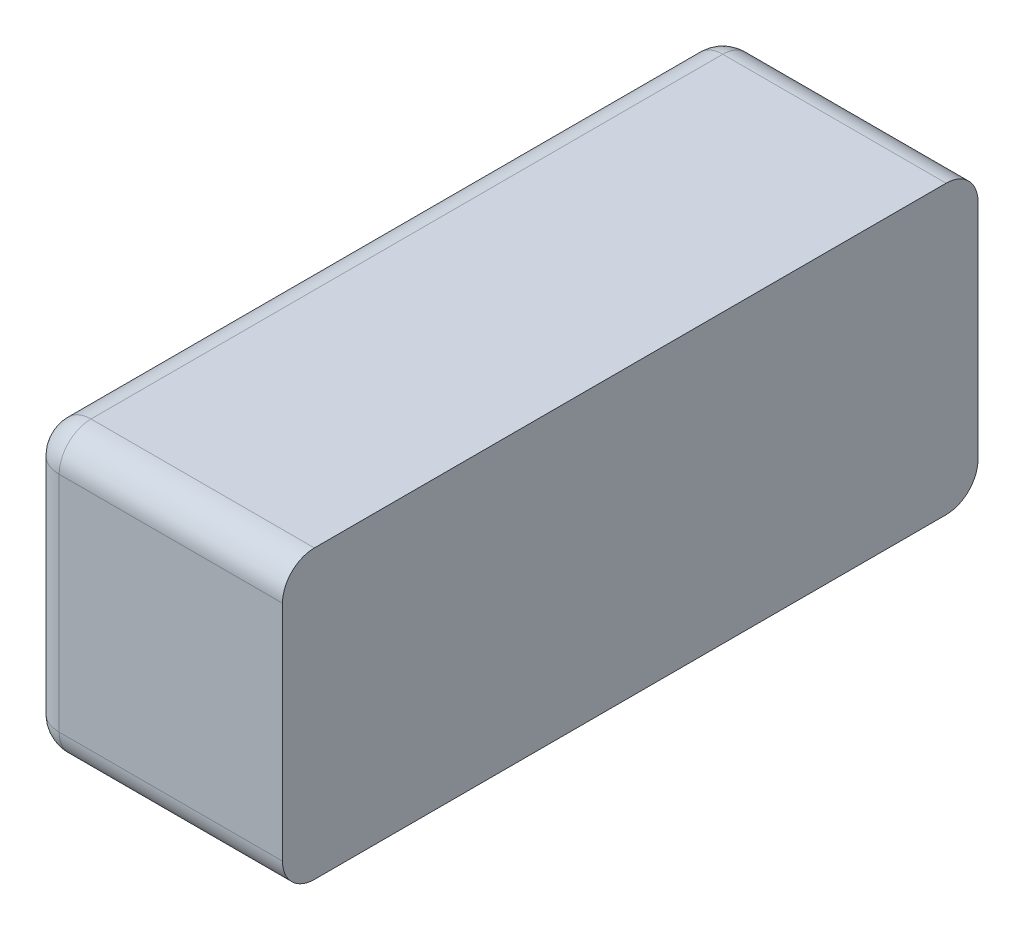
ISO-10303-21;
HEADER;
FILE_DESCRIPTION(('STEP AP214'),'2;1');
FILE_NAME('part.step','',(''),(''),'','','');
FILE_SCHEMA(('AUTOMOTIVE_DESIGN { 1 0 10303 214 1 1 1 1 }'));
ENDSEC;
DATA;
#1=APPLICATION_CONTEXT('core data for automotive mechanical design processes');
#2=APPLICATION_PROTOCOL_DEFINITION('international standard','automotive_design',2000,#1);
#3=PRODUCT_CONTEXT('',#1,'mechanical');
#4=PRODUCT('Part','Part','',(#3));
#5=PRODUCT_RELATED_PRODUCT_CATEGORY('part','',(#4));
#6=PRODUCT_DEFINITION_FORMATION('','',#4);
#7=PRODUCT_DEFINITION_CONTEXT('part definition',#1,'design');
#8=PRODUCT_DEFINITION('design','',#6,#7);
#9=PRODUCT_DEFINITION_SHAPE('','',#8);
#10=(LENGTH_UNIT() NAMED_UNIT(*) SI_UNIT(.MILLI.,.METRE.));
#11=(NAMED_UNIT(*) PLANE_ANGLE_UNIT() SI_UNIT($,.RADIAN.));
#12=(NAMED_UNIT(*) SI_UNIT($,.STERADIAN.) SOLID_ANGLE_UNIT());
#13=UNCERTAINTY_MEASURE_WITH_UNIT(LENGTH_MEASURE(1.E-05),#10,'distance_accuracy_value','');
#14=(GEOMETRIC_REPRESENTATION_CONTEXT(3) GLOBAL_UNCERTAINTY_ASSIGNED_CONTEXT((#13)) GLOBAL_UNIT_ASSIGNED_CONTEXT((#10,
#11,#12)) REPRESENTATION_CONTEXT('',''));
#15=CARTESIAN_POINT('',(0.,0.,0.));
#16=DIRECTION('',(0.,0.,1.));
#17=DIRECTION('',(1.,0.,0.));
#18=AXIS2_PLACEMENT_3D('',#15,#16,#17);
#19=CARTESIAN_POINT('',(-25.7142857142857,22.5,109.));
#20=DIRECTION('',(1.,0.,0.));
#21=DIRECTION('',(0.,0.,-1.));
#22=AXIS2_PLACEMENT_3D('',#19,#20,#21);
#23=PLANE('',#22);
#24=DIRECTION('',(0.,-1.,0.));
#25=VECTOR('',#24,1.);
#26=CARTESIAN_POINT('',(-25.7142857142857,22.5,5.));
#27=LINE('',#26,#25);
#28=CARTESIAN_POINT('',(-25.7142857142857,17.5,5.));
#29=VERTEX_POINT('',#28);
#30=CARTESIAN_POINT('',(-25.7142857142857,-17.5,5.));
#31=VERTEX_POINT('',#30);
#32=EDGE_CURVE('E221',#29,#31,#27,.T.);
#33=ORIENTED_EDGE('',*,*,#32,.T.);
#34=DIRECTION('',(0.,0.,-1.));
#35=VECTOR('',#34,1.);
#36=CARTESIAN_POINT('',(-25.7142857142857,-17.5,109.));
#37=LINE('',#36,#35);
#38=CARTESIAN_POINT('',(-25.7142857142857,-17.5,104.));
#39=VERTEX_POINT('',#38);
#40=EDGE_CURVE('E233',#31,#39,#37,.F.);
#41=ORIENTED_EDGE('',*,*,#40,.T.);
#42=DIRECTION('',(0.,-1.,0.));
#43=VECTOR('',#42,1.);
#44=CARTESIAN_POINT('',(-25.7142857142857,22.5,104.));
#45=LINE('',#44,#43);
#46=CARTESIAN_POINT('',(-25.7142857142857,17.5,104.));
#47=VERTEX_POINT('',#46);
#48=EDGE_CURVE('E229',#39,#47,#45,.F.);
#49=ORIENTED_EDGE('',*,*,#48,.T.);
#50=DIRECTION('',(0.,0.,-1.));
#51=VECTOR('',#50,1.);
#52=CARTESIAN_POINT('',(-25.7142857142857,17.5,109.));
#53=LINE('',#52,#51);
#54=EDGE_CURVE('E138',#47,#29,#53,.T.);
#55=ORIENTED_EDGE('',*,*,#54,.T.);
#56=EDGE_LOOP('',(#33,#41,#49,#55));
#57=FACE_BOUND('',#56,.T.);
#58=ADVANCED_FACE('F44',(#57),#23,.F.);
#59=CARTESIAN_POINT('',(-25.7142857142857,-22.5,109.));
#60=DIRECTION('',(0.,1.,0.));
#61=DIRECTION('',(0.,0.,1.));
#62=AXIS2_PLACEMENT_3D('',#59,#60,#61);
#63=PLANE('',#62);
#64=DIRECTION('',(0.,0.,-1.));
#65=VECTOR('',#64,1.);
#66=CARTESIAN_POINT('',(-20.7142857142857,-22.5,109.));
#67=LINE('',#66,#65);
#68=CARTESIAN_POINT('',(-20.7142857142857,-22.5,104.));
#69=VERTEX_POINT('',#68);
#70=CARTESIAN_POINT('',(-20.7142857142857,-22.5,5.));
#71=VERTEX_POINT('',#70);
#72=EDGE_CURVE('E243',#69,#71,#67,.T.);
#73=ORIENTED_EDGE('',*,*,#72,.T.);
#74=DIRECTION('',(1.,0.,0.));
#75=VECTOR('',#74,1.);
#76=CARTESIAN_POINT('',(-25.7142857142857,-22.5,5.));
#77=LINE('',#76,#75);
#78=CARTESIAN_POINT('',(14.2857142857143,-22.5,5.));
#79=VERTEX_POINT('',#78);
#80=EDGE_CURVE('E246',#71,#79,#77,.T.);
#81=ORIENTED_EDGE('',*,*,#80,.T.);
#82=DIRECTION('',(0.,0.,-1.));
#83=VECTOR('',#82,1.);
#84=CARTESIAN_POINT('',(14.2857142857143,-22.5,109.));
#85=LINE('',#84,#83);
#86=CARTESIAN_POINT('',(14.2857142857143,-22.5,104.));
#87=VERTEX_POINT('',#86);
#88=EDGE_CURVE('E212',#87,#79,#85,.T.);
#89=ORIENTED_EDGE('',*,*,#88,.F.);
#90=DIRECTION('',(1.,0.,0.));
#91=VECTOR('',#90,1.);
#92=CARTESIAN_POINT('',(-25.7142857142857,-22.5,104.));
#93=LINE('',#92,#91);
#94=EDGE_CURVE('E155',#87,#69,#93,.F.);
#95=ORIENTED_EDGE('',*,*,#94,.T.);
#96=EDGE_LOOP('',(#73,#81,#89,#95));
#97=FACE_BOUND('',#96,.T.);
#98=ADVANCED_FACE('F276',(#97),#63,.F.);
#99=CARTESIAN_POINT('',(14.2857142857143,-22.5,109.));
#100=DIRECTION('',(-1.,0.,0.));
#101=DIRECTION('',(0.,0.,1.));
#102=AXIS2_PLACEMENT_3D('',#99,#100,#101);
#103=PLANE('',#102);
#104=ORIENTED_EDGE('',*,*,#88,.T.);
#105=CARTESIAN_POINT('',(14.2857142857143,-17.5,5.));
#106=DIRECTION('',(-1.,0.,0.));
#107=DIRECTION('',(0.,0.,1.));
#108=AXIS2_PLACEMENT_3D('',#105,#106,#107);
#109=CIRCLE('',#108,5.);
#110=CARTESIAN_POINT('',(14.2857142857143,-17.5,0.));
#111=VERTEX_POINT('',#110);
#112=EDGE_CURVE('E11',#79,#111,#109,.F.);
#113=ORIENTED_EDGE('',*,*,#112,.T.);
#114=DIRECTION('',(0.,1.,0.));
#115=VECTOR('',#114,1.);
#116=CARTESIAN_POINT('',(14.2857142857143,-22.5,0.));
#117=LINE('',#116,#115);
#118=CARTESIAN_POINT('',(14.2857142857143,17.5,0.));
#119=VERTEX_POINT('',#118);
#120=EDGE_CURVE('E146',#111,#119,#117,.T.);
#121=ORIENTED_EDGE('',*,*,#120,.T.);
#122=CARTESIAN_POINT('',(14.2857142857143,17.5,5.));
#123=DIRECTION('',(-1.,0.,0.));
#124=DIRECTION('',(0.,0.,1.));
#125=AXIS2_PLACEMENT_3D('',#122,#123,#124);
#126=CIRCLE('',#125,5.);
#127=CARTESIAN_POINT('',(14.2857142857143,22.5,5.));
#128=VERTEX_POINT('',#127);
#129=EDGE_CURVE('E54',#119,#128,#126,.F.);
#130=ORIENTED_EDGE('',*,*,#129,.T.);
#131=DIRECTION('',(0.,0.,-1.));
#132=VECTOR('',#131,1.);
#133=CARTESIAN_POINT('',(14.2857142857143,22.5,109.));
#134=LINE('',#133,#132);
#135=CARTESIAN_POINT('',(14.2857142857143,22.5,104.));
#136=VERTEX_POINT('',#135);
#137=EDGE_CURVE('E150',#136,#128,#134,.T.);
#138=ORIENTED_EDGE('',*,*,#137,.F.);
#139=CARTESIAN_POINT('',(14.2857142857143,17.5,104.));
#140=DIRECTION('',(-1.,0.,0.));
#141=DIRECTION('',(0.,0.,1.));
#142=AXIS2_PLACEMENT_3D('',#139,#140,#141);
#143=CIRCLE('',#142,5.);
#144=CARTESIAN_POINT('',(14.2857142857143,17.5,109.));
#145=VERTEX_POINT('',#144);
#146=EDGE_CURVE('E144',#136,#145,#143,.F.);
#147=ORIENTED_EDGE('',*,*,#146,.T.);
#148=DIRECTION('',(0.,1.,0.));
#149=VECTOR('',#148,1.);
#150=CARTESIAN_POINT('',(14.2857142857143,-22.5,109.));
#151=LINE('',#150,#149);
#152=CARTESIAN_POINT('',(14.2857142857143,-17.5,109.));
#153=VERTEX_POINT('',#152);
#154=EDGE_CURVE('E126',#153,#145,#151,.T.);
#155=ORIENTED_EDGE('',*,*,#154,.F.);
#156=CARTESIAN_POINT('',(14.2857142857143,-17.5,104.));
#157=DIRECTION('',(-1.,0.,0.));
#158=DIRECTION('',(0.,0.,1.));
#159=AXIS2_PLACEMENT_3D('',#156,#157,#158);
#160=CIRCLE('',#159,5.);
#161=EDGE_CURVE('E143',#153,#87,#160,.F.);
#162=ORIENTED_EDGE('',*,*,#161,.T.);
#163=EDGE_LOOP('',(#104,#113,#121,#130,#138,#147,#155,#162));
#164=FACE_BOUND('',#163,.T.);
#165=ADVANCED_FACE('F137',(#164),#103,.F.);
#166=CARTESIAN_POINT('',(14.2857142857143,22.5,109.));
#167=DIRECTION('',(0.,-1.,0.));
#168=DIRECTION('',(0.,0.,-1.));
#169=AXIS2_PLACEMENT_3D('',#166,#167,#168);
#170=PLANE('',#169);
#171=ORIENTED_EDGE('',*,*,#137,.T.);
#172=DIRECTION('',(-1.,0.,0.));
#173=VECTOR('',#172,1.);
#174=CARTESIAN_POINT('',(14.2857142857143,22.5,5.));
#175=LINE('',#174,#173);
#176=CARTESIAN_POINT('',(-20.7142857142857,22.5,5.));
#177=VERTEX_POINT('',#176);
#178=EDGE_CURVE('E65',#128,#177,#175,.T.);
#179=ORIENTED_EDGE('',*,*,#178,.T.);
#180=DIRECTION('',(0.,0.,-1.));
#181=VECTOR('',#180,1.);
#182=CARTESIAN_POINT('',(-20.7142857142857,22.5,109.));
#183=LINE('',#182,#181);
#184=CARTESIAN_POINT('',(-20.7142857142857,22.5,104.));
#185=VERTEX_POINT('',#184);
#186=EDGE_CURVE('E66',#177,#185,#183,.F.);
#187=ORIENTED_EDGE('',*,*,#186,.T.);
#188=DIRECTION('',(-1.,0.,0.));
#189=VECTOR('',#188,1.);
#190=CARTESIAN_POINT('',(14.2857142857143,22.5,104.));
#191=LINE('',#190,#189);
#192=EDGE_CURVE('E253',#185,#136,#191,.F.);
#193=ORIENTED_EDGE('',*,*,#192,.T.);
#194=EDGE_LOOP('',(#171,#179,#187,#193));
#195=FACE_BOUND('',#194,.T.);
#196=ADVANCED_FACE('F258',(#195),#170,.F.);
#197=CARTESIAN_POINT('',(0.,0.,109.));
#198=DIRECTION('',(0.,0.,1.));
#199=DIRECTION('',(1.,0.,0.));
#200=AXIS2_PLACEMENT_3D('',#197,#198,#199);
#201=PLANE('',#200);
#202=DIRECTION('',(0.,-1.,0.));
#203=VECTOR('',#202,1.);
#204=CARTESIAN_POINT('',(-20.7142857142857,-22.5,109.));
#205=LINE('',#204,#203);
#206=CARTESIAN_POINT('',(-20.7142857142857,17.5,109.));
#207=VERTEX_POINT('',#206);
#208=CARTESIAN_POINT('',(-20.7142857142857,-17.5,109.));
#209=VERTEX_POINT('',#208);
#210=EDGE_CURVE('E132',#207,#209,#205,.T.);
#211=ORIENTED_EDGE('',*,*,#210,.T.);
#212=DIRECTION('',(1.,0.,0.));
#213=VECTOR('',#212,1.);
#214=CARTESIAN_POINT('',(14.2857142857143,-17.5,109.));
#215=LINE('',#214,#213);
#216=EDGE_CURVE('E122',#209,#153,#215,.T.);
#217=ORIENTED_EDGE('',*,*,#216,.T.);
#218=ORIENTED_EDGE('',*,*,#154,.T.);
#219=DIRECTION('',(-1.,0.,0.));
#220=VECTOR('',#219,1.);
#221=CARTESIAN_POINT('',(-25.7142857142857,17.5,109.));
#222=LINE('',#221,#220);
#223=EDGE_CURVE('E220',#145,#207,#222,.T.);
#224=ORIENTED_EDGE('',*,*,#223,.T.);
#225=EDGE_LOOP('',(#211,#217,#218,#224));
#226=FACE_BOUND('',#225,.T.);
#227=ADVANCED_FACE('F130',(#226),#201,.T.);
#228=CARTESIAN_POINT('',(0.,0.,0.));
#229=DIRECTION('',(0.,0.,1.));
#230=DIRECTION('',(1.,0.,0.));
#231=AXIS2_PLACEMENT_3D('',#228,#229,#230);
#232=PLANE('',#231);
#233=ORIENTED_EDGE('',*,*,#120,.F.);
#234=DIRECTION('',(1.,0.,0.));
#235=VECTOR('',#234,1.);
#236=CARTESIAN_POINT('',(0.,-17.5,0.));
#237=LINE('',#236,#235);
#238=CARTESIAN_POINT('',(-20.7142857142857,-17.5,0.));
#239=VERTEX_POINT('',#238);
#240=EDGE_CURVE('E238',#111,#239,#237,.F.);
#241=ORIENTED_EDGE('',*,*,#240,.T.);
#242=DIRECTION('',(0.,-1.,0.));
#243=VECTOR('',#242,1.);
#244=CARTESIAN_POINT('',(-20.7142857142857,0.,0.));
#245=LINE('',#244,#243);
#246=CARTESIAN_POINT('',(-20.7142857142857,17.5,0.));
#247=VERTEX_POINT('',#246);
#248=EDGE_CURVE('E240',#239,#247,#245,.F.);
#249=ORIENTED_EDGE('',*,*,#248,.T.);
#250=DIRECTION('',(-1.,0.,0.));
#251=VECTOR('',#250,1.);
#252=CARTESIAN_POINT('',(0.,17.5,0.));
#253=LINE('',#252,#251);
#254=EDGE_CURVE('E234',#247,#119,#253,.F.);
#255=ORIENTED_EDGE('',*,*,#254,.T.);
#256=EDGE_LOOP('',(#233,#241,#249,#255));
#257=FACE_BOUND('',#256,.T.);
#258=ADVANCED_FACE('F294',(#257),#232,.F.);
#259=CARTESIAN_POINT('',(14.2857142857143,17.5,5.));
#260=DIRECTION('',(-1.,0.,0.));
#261=DIRECTION('',(0.,0.,1.));
#262=AXIS2_PLACEMENT_3D('',#259,#260,#261);
#263=CYLINDRICAL_SURFACE('',#262,5.);
#264=ORIENTED_EDGE('',*,*,#129,.F.);
#265=ORIENTED_EDGE('',*,*,#254,.F.);
#266=CARTESIAN_POINT('',(-20.7142857142857,17.5,5.));
#267=DIRECTION('',(-1.,0.,0.));
#268=DIRECTION('',(0.,0.,1.));
#269=AXIS2_PLACEMENT_3D('',#266,#267,#268);
#270=CIRCLE('',#269,5.);
#271=EDGE_CURVE('E196',#177,#247,#270,.T.);
#272=ORIENTED_EDGE('',*,*,#271,.F.);
#273=ORIENTED_EDGE('',*,*,#178,.F.);
#274=EDGE_LOOP('',(#264,#265,#272,#273));
#275=FACE_BOUND('',#274,.T.);
#276=ADVANCED_FACE('F50',(#275),#263,.T.);
#277=CARTESIAN_POINT('',(-25.7142857142857,-17.5,5.));
#278=DIRECTION('',(1.,0.,0.));
#279=DIRECTION('',(0.,0.,-1.));
#280=AXIS2_PLACEMENT_3D('',#277,#278,#279);
#281=CYLINDRICAL_SURFACE('',#280,5.);
#282=ORIENTED_EDGE('',*,*,#112,.F.);
#283=ORIENTED_EDGE('',*,*,#80,.F.);
#284=CARTESIAN_POINT('',(-20.7142857142857,-17.5,5.));
#285=DIRECTION('',(-1.,0.,0.));
#286=DIRECTION('',(0.,0.,1.));
#287=AXIS2_PLACEMENT_3D('',#284,#285,#286);
#288=CIRCLE('',#287,5.);
#289=EDGE_CURVE('E192',#239,#71,#288,.T.);
#290=ORIENTED_EDGE('',*,*,#289,.F.);
#291=ORIENTED_EDGE('',*,*,#240,.F.);
#292=EDGE_LOOP('',(#282,#283,#290,#291));
#293=FACE_BOUND('',#292,.T.);
#294=ADVANCED_FACE('F285',(#293),#281,.T.);
#295=CARTESIAN_POINT('',(-20.7142857142857,22.5,5.));
#296=DIRECTION('',(0.,-1.,0.));
#297=DIRECTION('',(0.,0.,-1.));
#298=AXIS2_PLACEMENT_3D('',#295,#296,#297);
#299=CYLINDRICAL_SURFACE('',#298,5.);
#300=CARTESIAN_POINT('',(-20.7142857142857,17.5,5.));
#301=DIRECTION('',(0.,1.,0.));
#302=DIRECTION('',(0.,0.,1.));
#303=AXIS2_PLACEMENT_3D('',#300,#301,#302);
#304=CIRCLE('',#303,5.);
#305=EDGE_CURVE('E47',#247,#29,#304,.T.);
#306=ORIENTED_EDGE('',*,*,#305,.F.);
#307=ORIENTED_EDGE('',*,*,#248,.F.);
#308=CARTESIAN_POINT('',(-20.7142857142857,-17.5,5.));
#309=DIRECTION('',(0.,-1.,0.));
#310=DIRECTION('',(0.,0.,-1.));
#311=AXIS2_PLACEMENT_3D('',#308,#309,#310);
#312=CIRCLE('',#311,5.);
#313=EDGE_CURVE('E193',#31,#239,#312,.T.);
#314=ORIENTED_EDGE('',*,*,#313,.F.);
#315=ORIENTED_EDGE('',*,*,#32,.F.);
#316=EDGE_LOOP('',(#306,#307,#314,#315));
#317=FACE_BOUND('',#316,.T.);
#318=ADVANCED_FACE('F292',(#317),#299,.T.);
#319=CARTESIAN_POINT('',(-20.7142857142857,17.5,5.));
#320=DIRECTION('',(0.,0.,-1.));
#321=DIRECTION('',(-1.,0.,0.));
#322=AXIS2_PLACEMENT_3D('',#319,#320,#321);
#323=SPHERICAL_SURFACE('',#322,5.);
#324=ORIENTED_EDGE('',*,*,#271,.T.);
#325=ORIENTED_EDGE('',*,*,#305,.T.);
#326=CARTESIAN_POINT('',(-20.7142857142857,17.5,5.));
#327=DIRECTION('',(0.,0.,-1.));
#328=DIRECTION('',(-1.,0.,0.));
#329=AXIS2_PLACEMENT_3D('',#326,#327,#328);
#330=CIRCLE('',#329,5.);
#331=EDGE_CURVE('E189',#177,#29,#330,.F.);
#332=ORIENTED_EDGE('',*,*,#331,.F.);
#333=EDGE_LOOP('',(#324,#325,#332));
#334=FACE_BOUND('',#333,.T.);
#335=ADVANCED_FACE('F297',(#334),#323,.T.);
#336=CARTESIAN_POINT('',(-20.7142857142857,-17.5,5.));
#337=DIRECTION('',(0.,0.,-1.));
#338=DIRECTION('',(-1.,0.,0.));
#339=AXIS2_PLACEMENT_3D('',#336,#337,#338);
#340=SPHERICAL_SURFACE('',#339,5.);
#341=ORIENTED_EDGE('',*,*,#313,.T.);
#342=ORIENTED_EDGE('',*,*,#289,.T.);
#343=CARTESIAN_POINT('',(-20.7142857142857,-17.5,5.));
#344=DIRECTION('',(0.,0.,-1.));
#345=DIRECTION('',(-1.,0.,0.));
#346=AXIS2_PLACEMENT_3D('',#343,#344,#345);
#347=CIRCLE('',#346,5.);
#348=EDGE_CURVE('E181',#31,#71,#347,.F.);
#349=ORIENTED_EDGE('',*,*,#348,.F.);
#350=EDGE_LOOP('',(#341,#342,#349));
#351=FACE_BOUND('',#350,.T.);
#352=ADVANCED_FACE('F288',(#351),#340,.T.);
#353=CARTESIAN_POINT('',(-20.7142857142857,17.5,109.));
#354=DIRECTION('',(0.,0.,-1.));
#355=DIRECTION('',(-1.,0.,0.));
#356=AXIS2_PLACEMENT_3D('',#353,#354,#355);
#357=CYLINDRICAL_SURFACE('',#356,5.);
#358=ORIENTED_EDGE('',*,*,#331,.T.);
#359=ORIENTED_EDGE('',*,*,#54,.F.);
#360=CARTESIAN_POINT('',(-20.7142857142857,17.5,104.));
#361=DIRECTION('',(0.,0.,1.));
#362=DIRECTION('',(1.,0.,0.));
#363=AXIS2_PLACEMENT_3D('',#360,#361,#362);
#364=CIRCLE('',#363,5.);
#365=EDGE_CURVE('E179',#185,#47,#364,.T.);
#366=ORIENTED_EDGE('',*,*,#365,.F.);
#367=ORIENTED_EDGE('',*,*,#186,.F.);
#368=EDGE_LOOP('',(#358,#359,#366,#367));
#369=FACE_BOUND('',#368,.T.);
#370=ADVANCED_FACE('F300',(#369),#357,.T.);
#371=CARTESIAN_POINT('',(0.,17.5,104.));
#372=DIRECTION('',(1.,0.,0.));
#373=DIRECTION('',(0.,0.,-1.));
#374=AXIS2_PLACEMENT_3D('',#371,#372,#373);
#375=CYLINDRICAL_SURFACE('',#374,5.);
#376=ORIENTED_EDGE('',*,*,#146,.F.);
#377=ORIENTED_EDGE('',*,*,#192,.F.);
#378=CARTESIAN_POINT('',(-20.7142857142857,17.5,104.));
#379=DIRECTION('',(-1.,0.,0.));
#380=DIRECTION('',(0.,0.,1.));
#381=AXIS2_PLACEMENT_3D('',#378,#379,#380);
#382=CIRCLE('',#381,5.);
#383=EDGE_CURVE('E173',#207,#185,#382,.T.);
#384=ORIENTED_EDGE('',*,*,#383,.F.);
#385=ORIENTED_EDGE('',*,*,#223,.F.);
#386=EDGE_LOOP('',(#376,#377,#384,#385));
#387=FACE_BOUND('',#386,.T.);
#388=ADVANCED_FACE('F257',(#387),#375,.T.);
#389=CARTESIAN_POINT('',(0.,-17.5,104.));
#390=DIRECTION('',(-1.,0.,0.));
#391=DIRECTION('',(0.,0.,1.));
#392=AXIS2_PLACEMENT_3D('',#389,#390,#391);
#393=CYLINDRICAL_SURFACE('',#392,5.);
#394=ORIENTED_EDGE('',*,*,#161,.F.);
#395=ORIENTED_EDGE('',*,*,#216,.F.);
#396=CARTESIAN_POINT('',(-20.7142857142857,-17.5,104.));
#397=DIRECTION('',(-1.,0.,0.));
#398=DIRECTION('',(0.,0.,1.));
#399=AXIS2_PLACEMENT_3D('',#396,#397,#398);
#400=CIRCLE('',#399,5.);
#401=EDGE_CURVE('E172',#69,#209,#400,.T.);
#402=ORIENTED_EDGE('',*,*,#401,.F.);
#403=ORIENTED_EDGE('',*,*,#94,.F.);
#404=EDGE_LOOP('',(#394,#395,#402,#403));
#405=FACE_BOUND('',#404,.T.);
#406=ADVANCED_FACE('F151',(#405),#393,.T.);
#407=CARTESIAN_POINT('',(-20.7142857142857,-17.5,109.));
#408=DIRECTION('',(0.,0.,-1.));
#409=DIRECTION('',(-1.,0.,0.));
#410=AXIS2_PLACEMENT_3D('',#407,#408,#409);
#411=CYLINDRICAL_SURFACE('',#410,5.);
#412=ORIENTED_EDGE('',*,*,#348,.T.);
#413=ORIENTED_EDGE('',*,*,#72,.F.);
#414=CARTESIAN_POINT('',(-20.7142857142857,-17.5,104.));
#415=DIRECTION('',(0.,0.,1.));
#416=DIRECTION('',(1.,0.,0.));
#417=AXIS2_PLACEMENT_3D('',#414,#415,#416);
#418=CIRCLE('',#417,5.);
#419=EDGE_CURVE('E170',#39,#69,#418,.T.);
#420=ORIENTED_EDGE('',*,*,#419,.F.);
#421=ORIENTED_EDGE('',*,*,#40,.F.);
#422=EDGE_LOOP('',(#412,#413,#420,#421));
#423=FACE_BOUND('',#422,.T.);
#424=ADVANCED_FACE('F274',(#423),#411,.T.);
#425=CARTESIAN_POINT('',(-20.7142857142857,17.5,104.));
#426=DIRECTION('',(0.,1.,0.));
#427=DIRECTION('',(0.,0.,1.));
#428=AXIS2_PLACEMENT_3D('',#425,#426,#427);
#429=SPHERICAL_SURFACE('',#428,5.);
#430=ORIENTED_EDGE('',*,*,#383,.T.);
#431=ORIENTED_EDGE('',*,*,#365,.T.);
#432=CARTESIAN_POINT('',(-20.7142857142857,17.5,104.));
#433=DIRECTION('',(0.,1.,0.));
#434=DIRECTION('',(0.,0.,1.));
#435=AXIS2_PLACEMENT_3D('',#432,#433,#434);
#436=CIRCLE('',#435,5.);
#437=EDGE_CURVE('E163',#207,#47,#436,.F.);
#438=ORIENTED_EDGE('',*,*,#437,.F.);
#439=EDGE_LOOP('',(#430,#431,#438));
#440=FACE_BOUND('',#439,.T.);
#441=ADVANCED_FACE('F263',(#440),#429,.T.);
#442=CARTESIAN_POINT('',(-20.7142857142857,-17.5,104.));
#443=DIRECTION('',(0.,-1.,0.));
#444=DIRECTION('',(0.,0.,-1.));
#445=AXIS2_PLACEMENT_3D('',#442,#443,#444);
#446=SPHERICAL_SURFACE('',#445,5.);
#447=ORIENTED_EDGE('',*,*,#419,.T.);
#448=ORIENTED_EDGE('',*,*,#401,.T.);
#449=CARTESIAN_POINT('',(-20.7142857142857,-17.5,104.));
#450=DIRECTION('',(0.,-1.,0.));
#451=DIRECTION('',(0.,0.,-1.));
#452=AXIS2_PLACEMENT_3D('',#449,#450,#451);
#453=CIRCLE('',#452,5.);
#454=EDGE_CURVE('E161',#39,#209,#453,.F.);
#455=ORIENTED_EDGE('',*,*,#454,.F.);
#456=EDGE_LOOP('',(#447,#448,#455));
#457=FACE_BOUND('',#456,.T.);
#458=ADVANCED_FACE('F269',(#457),#446,.T.);
#459=CARTESIAN_POINT('',(-20.7142857142857,0.,104.));
#460=DIRECTION('',(0.,1.,0.));
#461=DIRECTION('',(0.,0.,1.));
#462=AXIS2_PLACEMENT_3D('',#459,#460,#461);
#463=CYLINDRICAL_SURFACE('',#462,5.);
#464=ORIENTED_EDGE('',*,*,#437,.T.);
#465=ORIENTED_EDGE('',*,*,#48,.F.);
#466=ORIENTED_EDGE('',*,*,#454,.T.);
#467=ORIENTED_EDGE('',*,*,#210,.F.);
#468=EDGE_LOOP('',(#464,#465,#466,#467));
#469=FACE_BOUND('',#468,.T.);
#470=ADVANCED_FACE('F270',(#469),#463,.T.);
#471=CLOSED_SHELL('',(#58,#98,#165,#196,#227,#258,#276,#294,#318,#335,#352,#370,#388,#406,#424,
#441,#458,#470));
#472=MANIFOLD_SOLID_BREP('B2',#471);
#473=ADVANCED_BREP_SHAPE_REPRESENTATION('',(#18,#472),#14);
#474=SHAPE_DEFINITION_REPRESENTATION(#9,#473);
ENDSEC;
END-ISO-10303-21;
